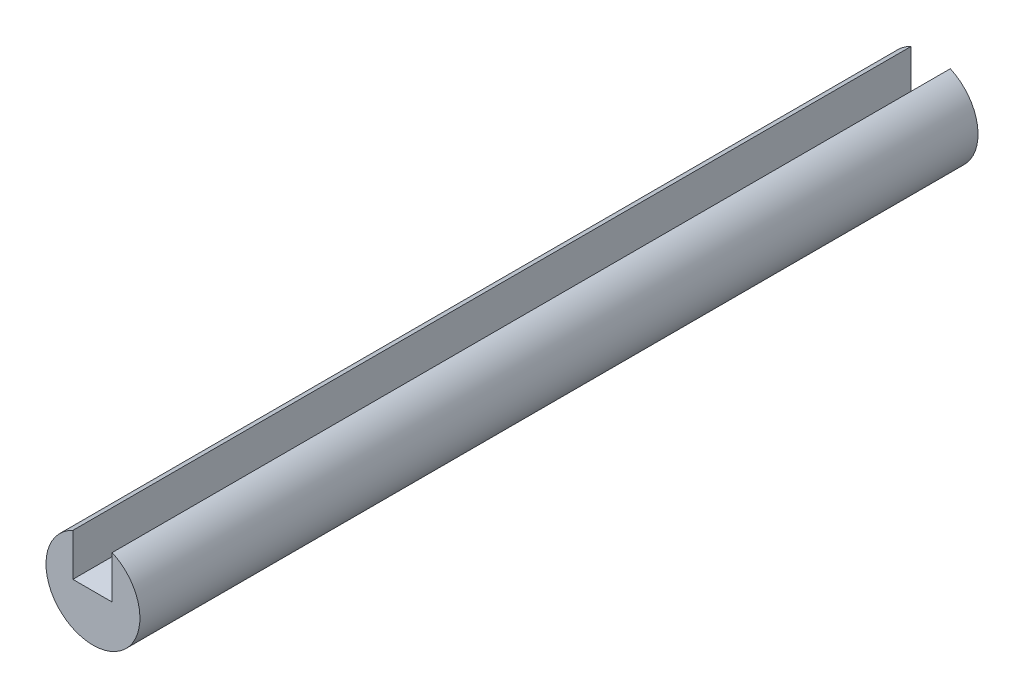
ISO-10303-21;
HEADER;
FILE_DESCRIPTION(('STEP AP214'),'2;1');
FILE_NAME('part.step','',(''),(''),'','','');
FILE_SCHEMA(('AUTOMOTIVE_DESIGN { 1 0 10303 214 1 1 1 1 }'));
ENDSEC;
DATA;
#1=APPLICATION_CONTEXT('core data for automotive mechanical design processes');
#2=APPLICATION_PROTOCOL_DEFINITION('international standard','automotive_design',2000,#1);
#3=PRODUCT_CONTEXT('',#1,'mechanical');
#4=PRODUCT('Part','Part','',(#3));
#5=PRODUCT_RELATED_PRODUCT_CATEGORY('part','',(#4));
#6=PRODUCT_DEFINITION_FORMATION('','',#4);
#7=PRODUCT_DEFINITION_CONTEXT('part definition',#1,'design');
#8=PRODUCT_DEFINITION('design','',#6,#7);
#9=PRODUCT_DEFINITION_SHAPE('','',#8);
#10=(LENGTH_UNIT() NAMED_UNIT(*) SI_UNIT(.MILLI.,.METRE.));
#11=(NAMED_UNIT(*) PLANE_ANGLE_UNIT() SI_UNIT($,.RADIAN.));
#12=(NAMED_UNIT(*) SI_UNIT($,.STERADIAN.) SOLID_ANGLE_UNIT());
#13=UNCERTAINTY_MEASURE_WITH_UNIT(LENGTH_MEASURE(1.E-05),#10,'distance_accuracy_value','');
#14=(GEOMETRIC_REPRESENTATION_CONTEXT(3) GLOBAL_UNCERTAINTY_ASSIGNED_CONTEXT((#13)) GLOBAL_UNIT_ASSIGNED_CONTEXT((#10,
#11,#12)) REPRESENTATION_CONTEXT('',''));
#15=CARTESIAN_POINT('',(0.,0.,0.));
#16=DIRECTION('',(0.,0.,1.));
#17=DIRECTION('',(1.,0.,0.));
#18=AXIS2_PLACEMENT_3D('',#15,#16,#17);
#19=CARTESIAN_POINT('',(0.,0.,-5.));
#20=DIRECTION('',(0.,0.,1.));
#21=DIRECTION('',(1.,0.,0.));
#22=AXIS2_PLACEMENT_3D('',#19,#20,#21);
#23=CYLINDRICAL_SURFACE('',#22,4.7625);
#24=DIRECTION('',(0.,0.,1.));
#25=VECTOR('',#24,1.);
#26=CARTESIAN_POINT('',(-2.03949083006365,4.30370577573401,-5.));
#27=LINE('',#26,#25);
#28=CARTESIAN_POINT('',(-2.03949083006365,4.30370577573401,-5.));
#29=VERTEX_POINT('',#28);
#30=CARTESIAN_POINT('',(-2.03949083006365,4.30370577573401,80.));
#31=VERTEX_POINT('',#30);
#32=EDGE_CURVE('E102',#29,#31,#27,.T.);
#33=ORIENTED_EDGE('',*,*,#32,.F.);
#34=CARTESIAN_POINT('',(0.,0.,-5.));
#35=DIRECTION('',(0.,0.,1.));
#36=DIRECTION('',(1.,0.,0.));
#37=AXIS2_PLACEMENT_3D('',#34,#35,#36);
#38=CIRCLE('',#37,4.7625);
#39=CARTESIAN_POINT('',(1.95014372353694,4.34492182985488,-5.));
#40=VERTEX_POINT('',#39);
#41=EDGE_CURVE('E44',#29,#40,#38,.T.);
#42=ORIENTED_EDGE('',*,*,#41,.T.);
#43=DIRECTION('',(0.,0.,1.));
#44=VECTOR('',#43,1.);
#45=CARTESIAN_POINT('',(1.95014372353694,4.34492182985488,-5.));
#46=LINE('',#45,#44);
#47=CARTESIAN_POINT('',(1.95014372353694,4.34492182985488,80.));
#48=VERTEX_POINT('',#47);
#49=EDGE_CURVE('E88',#48,#40,#46,.F.);
#50=ORIENTED_EDGE('',*,*,#49,.F.);
#51=CARTESIAN_POINT('',(0.,0.,80.));
#52=DIRECTION('',(0.,0.,1.));
#53=DIRECTION('',(1.,0.,0.));
#54=AXIS2_PLACEMENT_3D('',#51,#52,#53);
#55=CIRCLE('',#54,4.7625);
#56=EDGE_CURVE('E104',#31,#48,#55,.T.);
#57=ORIENTED_EDGE('',*,*,#56,.F.);
#58=EDGE_LOOP('',(#33,#42,#50,#57));
#59=FACE_BOUND('',#58,.T.);
#60=ADVANCED_FACE('F37',(#59),#23,.T.);
#61=CARTESIAN_POINT('',(0.,0.,-5.));
#62=DIRECTION('',(0.,0.,1.));
#63=DIRECTION('',(1.,0.,0.));
#64=AXIS2_PLACEMENT_3D('',#61,#62,#63);
#65=PLANE('',#64);
#66=ORIENTED_EDGE('',*,*,#41,.F.);
#67=DIRECTION('',(0.,-1.,0.));
#68=VECTOR('',#67,1.);
#69=CARTESIAN_POINT('',(-2.03949083006365,10.0040541578125,-5.));
#70=LINE('',#69,#68);
#71=CARTESIAN_POINT('',(-2.03949083006365,0.,-5.));
#72=VERTEX_POINT('',#71);
#73=EDGE_CURVE('E57',#29,#72,#70,.T.);
#74=ORIENTED_EDGE('',*,*,#73,.T.);
#75=DIRECTION('',(1.,0.,0.));
#76=VECTOR('',#75,1.);
#77=CARTESIAN_POINT('',(-2.03949083006365,0.,-5.));
#78=LINE('',#77,#76);
#79=CARTESIAN_POINT('',(1.95014372353694,0.,-5.));
#80=VERTEX_POINT('',#79);
#81=EDGE_CURVE('E78',#72,#80,#78,.T.);
#82=ORIENTED_EDGE('',*,*,#81,.T.);
#83=DIRECTION('',(0.,1.,0.));
#84=VECTOR('',#83,1.);
#85=CARTESIAN_POINT('',(1.95014372353694,0.,-5.));
#86=LINE('',#85,#84);
#87=EDGE_CURVE('E85',#80,#40,#86,.T.);
#88=ORIENTED_EDGE('',*,*,#87,.T.);
#89=EDGE_LOOP('',(#66,#74,#82,#88));
#90=FACE_BOUND('',#89,.T.);
#91=ADVANCED_FACE('F93',(#90),#65,.F.);
#92=CARTESIAN_POINT('',(0.,0.,80.));
#93=DIRECTION('',(0.,0.,1.));
#94=DIRECTION('',(1.,0.,0.));
#95=AXIS2_PLACEMENT_3D('',#92,#93,#94);
#96=PLANE('',#95);
#97=DIRECTION('',(0.,-1.,0.));
#98=VECTOR('',#97,1.);
#99=CARTESIAN_POINT('',(-2.03949083006365,0.,80.));
#100=LINE('',#99,#98);
#101=CARTESIAN_POINT('',(-2.03949083006365,0.,80.));
#102=VERTEX_POINT('',#101);
#103=EDGE_CURVE('E11',#31,#102,#100,.T.);
#104=ORIENTED_EDGE('',*,*,#103,.F.);
#105=ORIENTED_EDGE('',*,*,#56,.T.);
#106=DIRECTION('',(0.,1.,0.));
#107=VECTOR('',#106,1.);
#108=CARTESIAN_POINT('',(1.95014372353694,0.,80.));
#109=LINE('',#108,#107);
#110=CARTESIAN_POINT('',(1.95014372353694,0.,80.));
#111=VERTEX_POINT('',#110);
#112=EDGE_CURVE('E94',#111,#48,#109,.T.);
#113=ORIENTED_EDGE('',*,*,#112,.F.);
#114=DIRECTION('',(1.,0.,0.));
#115=VECTOR('',#114,1.);
#116=CARTESIAN_POINT('',(0.,0.,80.));
#117=LINE('',#116,#115);
#118=EDGE_CURVE('E80',#102,#111,#117,.T.);
#119=ORIENTED_EDGE('',*,*,#118,.F.);
#120=EDGE_LOOP('',(#104,#105,#113,#119));
#121=FACE_BOUND('',#120,.T.);
#122=ADVANCED_FACE('F111',(#121),#96,.T.);
#123=CARTESIAN_POINT('',(-2.03949083006365,10.0040541578125,-5.));
#124=DIRECTION('',(-1.,0.,0.));
#125=DIRECTION('',(0.,0.,1.));
#126=AXIS2_PLACEMENT_3D('',#123,#124,#125);
#127=PLANE('',#126);
#128=ORIENTED_EDGE('',*,*,#32,.T.);
#129=ORIENTED_EDGE('',*,*,#103,.T.);
#130=DIRECTION('',(0.,0.,1.));
#131=VECTOR('',#130,1.);
#132=CARTESIAN_POINT('',(-2.03949083006365,0.,-5.));
#133=LINE('',#132,#131);
#134=EDGE_CURVE('E51',#72,#102,#133,.T.);
#135=ORIENTED_EDGE('',*,*,#134,.F.);
#136=ORIENTED_EDGE('',*,*,#73,.F.);
#137=EDGE_LOOP('',(#128,#129,#135,#136));
#138=FACE_BOUND('',#137,.T.);
#139=ADVANCED_FACE('F109',(#138),#127,.F.);
#140=CARTESIAN_POINT('',(1.95014372353694,0.,-5.));
#141=DIRECTION('',(1.,0.,0.));
#142=DIRECTION('',(0.,0.,-1.));
#143=AXIS2_PLACEMENT_3D('',#140,#141,#142);
#144=PLANE('',#143);
#145=ORIENTED_EDGE('',*,*,#49,.T.);
#146=ORIENTED_EDGE('',*,*,#87,.F.);
#147=DIRECTION('',(0.,0.,1.));
#148=VECTOR('',#147,1.);
#149=CARTESIAN_POINT('',(1.95014372353694,0.,-5.));
#150=LINE('',#149,#148);
#151=EDGE_CURVE('E74',#80,#111,#150,.T.);
#152=ORIENTED_EDGE('',*,*,#151,.T.);
#153=ORIENTED_EDGE('',*,*,#112,.T.);
#154=EDGE_LOOP('',(#145,#146,#152,#153));
#155=FACE_BOUND('',#154,.T.);
#156=ADVANCED_FACE('F86',(#155),#144,.F.);
#157=CARTESIAN_POINT('',(0.,0.,-5.));
#158=DIRECTION('',(0.,-1.,0.));
#159=DIRECTION('',(0.,0.,-1.));
#160=AXIS2_PLACEMENT_3D('',#157,#158,#159);
#161=PLANE('',#160);
#162=ORIENTED_EDGE('',*,*,#118,.T.);
#163=ORIENTED_EDGE('',*,*,#151,.F.);
#164=ORIENTED_EDGE('',*,*,#81,.F.);
#165=ORIENTED_EDGE('',*,*,#134,.T.);
#166=EDGE_LOOP('',(#162,#163,#164,#165));
#167=FACE_BOUND('',#166,.T.);
#168=ADVANCED_FACE('F76',(#167),#161,.F.);
#169=CLOSED_SHELL('',(#60,#91,#122,#139,#156,#168));
#170=MANIFOLD_SOLID_BREP('B2',#169);
#171=ADVANCED_BREP_SHAPE_REPRESENTATION('',(#18,#170),#14);
#172=SHAPE_DEFINITION_REPRESENTATION(#9,#171);
ENDSEC;
END-ISO-10303-21;
